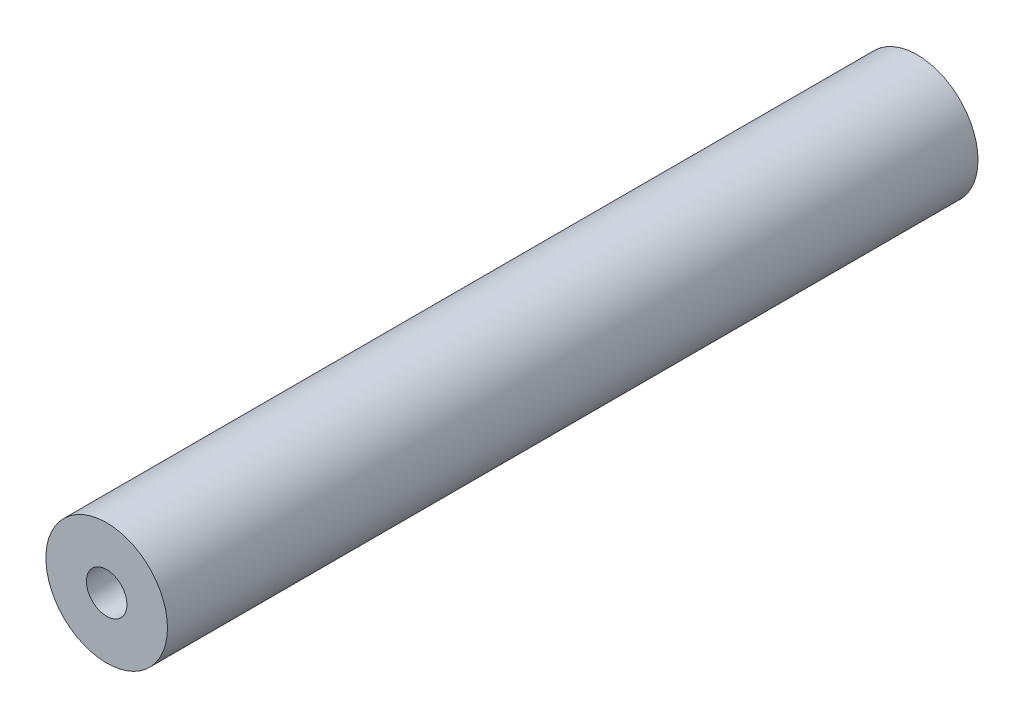
ISO-10303-21;
HEADER;
FILE_DESCRIPTION(('STEP AP214'),'2;1');
FILE_NAME('part.step','',(''),(''),'','','');
FILE_SCHEMA(('AUTOMOTIVE_DESIGN { 1 0 10303 214 1 1 1 1 }'));
ENDSEC;
DATA;
#1=APPLICATION_CONTEXT('core data for automotive mechanical design processes');
#2=APPLICATION_PROTOCOL_DEFINITION('international standard','automotive_design',2000,#1);
#3=PRODUCT_CONTEXT('',#1,'mechanical');
#4=PRODUCT('Part','Part','',(#3));
#5=PRODUCT_RELATED_PRODUCT_CATEGORY('part','',(#4));
#6=PRODUCT_DEFINITION_FORMATION('','',#4);
#7=PRODUCT_DEFINITION_CONTEXT('part definition',#1,'design');
#8=PRODUCT_DEFINITION('design','',#6,#7);
#9=PRODUCT_DEFINITION_SHAPE('','',#8);
#10=(LENGTH_UNIT() NAMED_UNIT(*) SI_UNIT(.MILLI.,.METRE.));
#11=(NAMED_UNIT(*) PLANE_ANGLE_UNIT() SI_UNIT($,.RADIAN.));
#12=(NAMED_UNIT(*) SI_UNIT($,.STERADIAN.) SOLID_ANGLE_UNIT());
#13=UNCERTAINTY_MEASURE_WITH_UNIT(LENGTH_MEASURE(1.E-05),#10,'distance_accuracy_value','');
#14=(GEOMETRIC_REPRESENTATION_CONTEXT(3) GLOBAL_UNCERTAINTY_ASSIGNED_CONTEXT((#13)) GLOBAL_UNIT_ASSIGNED_CONTEXT((#10,
#11,#12)) REPRESENTATION_CONTEXT('',''));
#15=CARTESIAN_POINT('',(0.,0.,0.));
#16=DIRECTION('',(0.,0.,1.));
#17=DIRECTION('',(1.,0.,0.));
#18=AXIS2_PLACEMENT_3D('',#15,#16,#17);
#19=CARTESIAN_POINT('',(0.,0.,63.5));
#20=DIRECTION('',(0.,0.,1.));
#21=DIRECTION('',(1.,0.,0.));
#22=AXIS2_PLACEMENT_3D('',#19,#20,#21);
#23=PLANE('',#22);
#24=CARTESIAN_POINT('',(0.,0.,63.5));
#25=DIRECTION('',(0.,0.,1.));
#26=DIRECTION('',(1.,0.,0.));
#27=AXIS2_PLACEMENT_3D('',#24,#25,#26);
#28=CIRCLE('',#27,4.7625);
#29=CARTESIAN_POINT('',(4.7625,0.,63.5));
#30=VERTEX_POINT('',#29);
#31=EDGE_CURVE('E10',#30,#30,#28,.T.);
#32=ORIENTED_EDGE('',*,*,#31,.T.);
#33=EDGE_LOOP('',(#32));
#34=FACE_BOUND('',#33,.T.);
#35=CARTESIAN_POINT('',(0.,0.,63.5));
#36=DIRECTION('',(0.,0.,-1.));
#37=DIRECTION('',(-1.,0.,0.));
#38=AXIS2_PLACEMENT_3D('',#35,#36,#37);
#39=CIRCLE('',#38,1.5875);
#40=CARTESIAN_POINT('',(-1.5875,0.,63.5));
#41=VERTEX_POINT('',#40);
#42=EDGE_CURVE('E49',#41,#41,#39,.T.);
#43=ORIENTED_EDGE('',*,*,#42,.T.);
#44=EDGE_LOOP('',(#43));
#45=FACE_BOUND('',#44,.T.);
#46=ADVANCED_FACE('F30',(#34,#45),#23,.T.);
#47=CARTESIAN_POINT('',(0.,0.,0.));
#48=DIRECTION('',(0.,0.,1.));
#49=DIRECTION('',(1.,0.,0.));
#50=AXIS2_PLACEMENT_3D('',#47,#48,#49);
#51=PLANE('',#50);
#52=CARTESIAN_POINT('',(0.,0.,0.));
#53=DIRECTION('',(0.,0.,1.));
#54=DIRECTION('',(1.,0.,0.));
#55=AXIS2_PLACEMENT_3D('',#52,#53,#54);
#56=CIRCLE('',#55,4.7625);
#57=CARTESIAN_POINT('',(4.7625,0.,0.));
#58=VERTEX_POINT('',#57);
#59=EDGE_CURVE('E34',#58,#58,#56,.T.);
#60=ORIENTED_EDGE('',*,*,#59,.F.);
#61=EDGE_LOOP('',(#60));
#62=FACE_BOUND('',#61,.T.);
#63=CARTESIAN_POINT('',(0.,0.,0.));
#64=DIRECTION('',(0.,0.,1.));
#65=DIRECTION('',(1.,0.,0.));
#66=AXIS2_PLACEMENT_3D('',#63,#64,#65);
#67=CIRCLE('',#66,1.5875);
#68=CARTESIAN_POINT('',(1.5875,0.,0.));
#69=VERTEX_POINT('',#68);
#70=EDGE_CURVE('E43',#69,#69,#67,.T.);
#71=ORIENTED_EDGE('',*,*,#70,.T.);
#72=EDGE_LOOP('',(#71));
#73=FACE_BOUND('',#72,.T.);
#74=ADVANCED_FACE('F67',(#62,#73),#51,.F.);
#75=CARTESIAN_POINT('',(0.,0.,63.5));
#76=DIRECTION('',(0.,0.,-1.));
#77=DIRECTION('',(-1.,0.,0.));
#78=AXIS2_PLACEMENT_3D('',#75,#76,#77);
#79=CYLINDRICAL_SURFACE('',#78,4.7625);
#80=ORIENTED_EDGE('',*,*,#31,.F.);
#81=EDGE_LOOP('',(#80));
#82=FACE_BOUND('',#81,.T.);
#83=ORIENTED_EDGE('',*,*,#59,.T.);
#84=EDGE_LOOP('',(#83));
#85=FACE_BOUND('',#84,.T.);
#86=ADVANCED_FACE('F32',(#82,#85),#79,.T.);
#87=CARTESIAN_POINT('',(0.,0.,12.7));
#88=DIRECTION('',(0.,0.,-1.));
#89=DIRECTION('',(-1.,0.,0.));
#90=AXIS2_PLACEMENT_3D('',#87,#88,#89);
#91=CYLINDRICAL_SURFACE('',#90,1.5875);
#92=CARTESIAN_POINT('',(0.,0.,12.7));
#93=DIRECTION('',(0.,0.,1.));
#94=DIRECTION('',(1.,0.,0.));
#95=AXIS2_PLACEMENT_3D('',#92,#93,#94);
#96=CIRCLE('',#95,1.5875);
#97=CARTESIAN_POINT('',(1.5875,0.,12.7));
#98=VERTEX_POINT('',#97);
#99=EDGE_CURVE('E41',#98,#98,#96,.T.);
#100=ORIENTED_EDGE('',*,*,#99,.T.);
#101=EDGE_LOOP('',(#100));
#102=FACE_BOUND('',#101,.T.);
#103=ORIENTED_EDGE('',*,*,#70,.F.);
#104=EDGE_LOOP('',(#103));
#105=FACE_BOUND('',#104,.T.);
#106=ADVANCED_FACE('F75',(#102,#105),#91,.F.);
#107=CARTESIAN_POINT('',(0.,0.,12.7));
#108=DIRECTION('',(0.,0.,1.));
#109=DIRECTION('',(1.,0.,0.));
#110=AXIS2_PLACEMENT_3D('',#107,#108,#109);
#111=PLANE('',#110);
#112=ORIENTED_EDGE('',*,*,#99,.F.);
#113=EDGE_LOOP('',(#112));
#114=FACE_BOUND('',#113,.T.);
#115=ADVANCED_FACE('F64',(#114),#111,.F.);
#116=CARTESIAN_POINT('',(0.,0.,50.8));
#117=DIRECTION('',(0.,0.,1.));
#118=DIRECTION('',(1.,0.,0.));
#119=AXIS2_PLACEMENT_3D('',#116,#117,#118);
#120=CYLINDRICAL_SURFACE('',#119,1.5875);
#121=CARTESIAN_POINT('',(0.,0.,50.8));
#122=DIRECTION('',(0.,0.,-1.));
#123=DIRECTION('',(-1.,0.,0.));
#124=AXIS2_PLACEMENT_3D('',#121,#122,#123);
#125=CIRCLE('',#124,1.5875);
#126=CARTESIAN_POINT('',(-1.5875,0.,50.8));
#127=VERTEX_POINT('',#126);
#128=EDGE_CURVE('E46',#127,#127,#125,.T.);
#129=ORIENTED_EDGE('',*,*,#128,.T.);
#130=EDGE_LOOP('',(#129));
#131=FACE_BOUND('',#130,.T.);
#132=ORIENTED_EDGE('',*,*,#42,.F.);
#133=EDGE_LOOP('',(#132));
#134=FACE_BOUND('',#133,.T.);
#135=ADVANCED_FACE('F55',(#131,#134),#120,.F.);
#136=CARTESIAN_POINT('',(0.,0.,50.8));
#137=DIRECTION('',(0.,0.,-1.));
#138=DIRECTION('',(-1.,0.,0.));
#139=AXIS2_PLACEMENT_3D('',#136,#137,#138);
#140=PLANE('',#139);
#141=ORIENTED_EDGE('',*,*,#128,.F.);
#142=EDGE_LOOP('',(#141));
#143=FACE_BOUND('',#142,.T.);
#144=ADVANCED_FACE('F58',(#143),#140,.F.);
#145=CLOSED_SHELL('',(#46,#74,#86,#106,#115,#135,#144));
#146=MANIFOLD_SOLID_BREP('B2',#145);
#147=ADVANCED_BREP_SHAPE_REPRESENTATION('',(#18,#146),#14);
#148=SHAPE_DEFINITION_REPRESENTATION(#9,#147);
ENDSEC;
END-ISO-10303-21;
